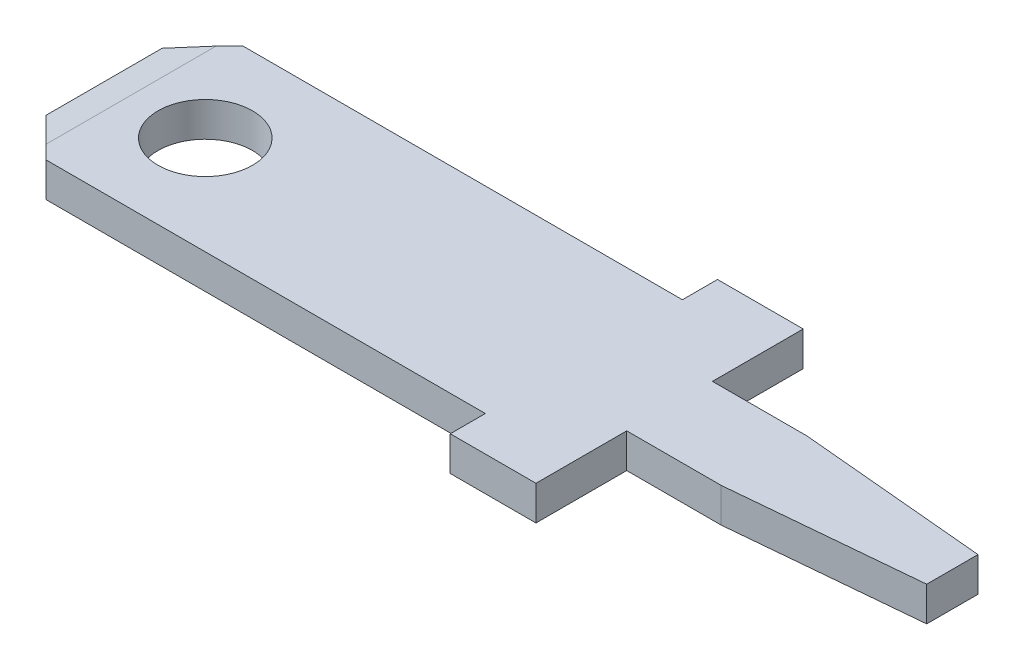
ISO-10303-21;
HEADER;
FILE_DESCRIPTION(('STEP AP214'),'2;1');
FILE_NAME('part.step','',(''),(''),'','','');
FILE_SCHEMA(('AUTOMOTIVE_DESIGN { 1 0 10303 214 1 1 1 1 }'));
ENDSEC;
DATA;
#1=APPLICATION_CONTEXT('core data for automotive mechanical design processes');
#2=APPLICATION_PROTOCOL_DEFINITION('international standard','automotive_design',2000,#1);
#3=PRODUCT_CONTEXT('',#1,'mechanical');
#4=PRODUCT('Part','Part','',(#3));
#5=PRODUCT_RELATED_PRODUCT_CATEGORY('part','',(#4));
#6=PRODUCT_DEFINITION_FORMATION('','',#4);
#7=PRODUCT_DEFINITION_CONTEXT('part definition',#1,'design');
#8=PRODUCT_DEFINITION('design','',#6,#7);
#9=PRODUCT_DEFINITION_SHAPE('','',#8);
#10=(LENGTH_UNIT() NAMED_UNIT(*) SI_UNIT(.MILLI.,.METRE.));
#11=(NAMED_UNIT(*) PLANE_ANGLE_UNIT() SI_UNIT($,.RADIAN.));
#12=(NAMED_UNIT(*) SI_UNIT($,.STERADIAN.) SOLID_ANGLE_UNIT());
#13=UNCERTAINTY_MEASURE_WITH_UNIT(LENGTH_MEASURE(1.E-05),#10,'distance_accuracy_value','');
#14=(GEOMETRIC_REPRESENTATION_CONTEXT(3) GLOBAL_UNCERTAINTY_ASSIGNED_CONTEXT((#13)) GLOBAL_UNIT_ASSIGNED_CONTEXT((#10,
#11,#12)) REPRESENTATION_CONTEXT('',''));
#15=CARTESIAN_POINT('',(0.,0.,0.));
#16=DIRECTION('',(0.,0.,1.));
#17=DIRECTION('',(1.,0.,0.));
#18=AXIS2_PLACEMENT_3D('',#15,#16,#17);
#19=CARTESIAN_POINT('',(0.,0.255,-0.634999999999997));
#20=DIRECTION('',(-1.,0.,0.));
#21=DIRECTION('',(0.,0.,1.));
#22=AXIS2_PLACEMENT_3D('',#19,#20,#21);
#23=PLANE('',#22);
#24=DIRECTION('',(0.,0.,-1.));
#25=VECTOR('',#24,1.);
#26=CARTESIAN_POINT('',(0.,-0.255,-0.634999999999997));
#27=LINE('',#26,#25);
#28=CARTESIAN_POINT('',(0.,-0.255,-0.634999999999997));
#29=VERTEX_POINT('',#28);
#30=CARTESIAN_POINT('',(0.,-0.255,-1.98));
#31=VERTEX_POINT('',#30);
#32=EDGE_CURVE('E172',#29,#31,#27,.T.);
#33=ORIENTED_EDGE('',*,*,#32,.T.);
#34=DIRECTION('',(0.,-1.,0.));
#35=VECTOR('',#34,1.);
#36=CARTESIAN_POINT('',(0.,0.255,-1.98));
#37=LINE('',#36,#35);
#38=CARTESIAN_POINT('',(0.,0.255,-1.98));
#39=VERTEX_POINT('',#38);
#40=EDGE_CURVE('E288',#39,#31,#37,.T.);
#41=ORIENTED_EDGE('',*,*,#40,.F.);
#42=DIRECTION('',(0.,0.,-1.));
#43=VECTOR('',#42,1.);
#44=CARTESIAN_POINT('',(0.,0.255,-0.634999999999997));
#45=LINE('',#44,#43);
#46=CARTESIAN_POINT('',(0.,0.255,-0.634999999999997));
#47=VERTEX_POINT('',#46);
#48=EDGE_CURVE('E234',#47,#39,#45,.T.);
#49=ORIENTED_EDGE('',*,*,#48,.F.);
#50=DIRECTION('',(0.,-1.,0.));
#51=VECTOR('',#50,1.);
#52=CARTESIAN_POINT('',(0.,0.255,-0.634999999999997));
#53=LINE('',#52,#51);
#54=EDGE_CURVE('E252',#47,#29,#53,.T.);
#55=ORIENTED_EDGE('',*,*,#54,.T.);
#56=EDGE_LOOP('',(#33,#41,#49,#55));
#57=FACE_BOUND('',#56,.T.);
#58=ADVANCED_FACE('F32',(#57),#23,.F.);
#59=CARTESIAN_POINT('',(0.,0.255,-1.98));
#60=DIRECTION('',(0.,0.,1.));
#61=DIRECTION('',(1.,0.,0.));
#62=AXIS2_PLACEMENT_3D('',#59,#60,#61);
#63=PLANE('',#62);
#64=DIRECTION('',(-1.,0.,0.));
#65=VECTOR('',#64,1.);
#66=CARTESIAN_POINT('',(0.,-0.255,-1.98));
#67=LINE('',#66,#65);
#68=CARTESIAN_POINT('',(-1.27,-0.255,-1.98));
#69=VERTEX_POINT('',#68);
#70=EDGE_CURVE('E255',#31,#69,#67,.T.);
#71=ORIENTED_EDGE('',*,*,#70,.T.);
#72=DIRECTION('',(0.,-1.,0.));
#73=VECTOR('',#72,1.);
#74=CARTESIAN_POINT('',(-1.27,0.255,-1.98));
#75=LINE('',#74,#73);
#76=CARTESIAN_POINT('',(-1.27,0.255,-1.98));
#77=VERTEX_POINT('',#76);
#78=EDGE_CURVE('E285',#77,#69,#75,.T.);
#79=ORIENTED_EDGE('',*,*,#78,.F.);
#80=DIRECTION('',(-1.,0.,0.));
#81=VECTOR('',#80,1.);
#82=CARTESIAN_POINT('',(0.,0.255,-1.98));
#83=LINE('',#82,#81);
#84=EDGE_CURVE('E237',#39,#77,#83,.T.);
#85=ORIENTED_EDGE('',*,*,#84,.F.);
#86=ORIENTED_EDGE('',*,*,#40,.T.);
#87=EDGE_LOOP('',(#71,#79,#85,#86));
#88=FACE_BOUND('',#87,.T.);
#89=ADVANCED_FACE('F328',(#88),#63,.F.);
#90=CARTESIAN_POINT('',(-1.27,0.255,-1.98));
#91=DIRECTION('',(1.,0.,0.));
#92=DIRECTION('',(0.,0.,-1.));
#93=AXIS2_PLACEMENT_3D('',#90,#91,#92);
#94=PLANE('',#93);
#95=DIRECTION('',(0.,0.,1.));
#96=VECTOR('',#95,1.);
#97=CARTESIAN_POINT('',(-1.27,-0.255,-1.98));
#98=LINE('',#97,#96);
#99=CARTESIAN_POINT('',(-1.27,-0.255,-1.46));
#100=VERTEX_POINT('',#99);
#101=EDGE_CURVE('E257',#69,#100,#98,.T.);
#102=ORIENTED_EDGE('',*,*,#101,.T.);
#103=DIRECTION('',(0.,-1.,0.));
#104=VECTOR('',#103,1.);
#105=CARTESIAN_POINT('',(-1.27,0.255,-1.46));
#106=LINE('',#105,#104);
#107=CARTESIAN_POINT('',(-1.27,0.255,-1.46));
#108=VERTEX_POINT('',#107);
#109=EDGE_CURVE('E282',#108,#100,#106,.T.);
#110=ORIENTED_EDGE('',*,*,#109,.F.);
#111=DIRECTION('',(0.,0.,1.));
#112=VECTOR('',#111,1.);
#113=CARTESIAN_POINT('',(-1.27,0.255,-1.98));
#114=LINE('',#113,#112);
#115=EDGE_CURVE('E240',#77,#108,#114,.T.);
#116=ORIENTED_EDGE('',*,*,#115,.F.);
#117=ORIENTED_EDGE('',*,*,#78,.T.);
#118=EDGE_LOOP('',(#102,#110,#116,#117));
#119=FACE_BOUND('',#118,.T.);
#120=ADVANCED_FACE('F334',(#119),#94,.F.);
#121=CARTESIAN_POINT('',(-1.27,0.255,-1.46));
#122=DIRECTION('',(0.,0.,1.));
#123=DIRECTION('',(1.,0.,0.));
#124=AXIS2_PLACEMENT_3D('',#121,#122,#123);
#125=PLANE('',#124);
#126=DIRECTION('',(-1.,0.,0.));
#127=VECTOR('',#126,1.);
#128=CARTESIAN_POINT('',(-1.27,-0.255,-1.46));
#129=LINE('',#128,#127);
#130=CARTESIAN_POINT('',(-7.78,-0.255,-1.46));
#131=VERTEX_POINT('',#130);
#132=EDGE_CURVE('E259',#100,#131,#129,.T.);
#133=ORIENTED_EDGE('',*,*,#132,.T.);
#134=DIRECTION('',(0.,-1.,0.));
#135=VECTOR('',#134,1.);
#136=CARTESIAN_POINT('',(-7.78,0.255,-1.46));
#137=LINE('',#136,#135);
#138=CARTESIAN_POINT('',(-7.78,0.255,-1.46));
#139=VERTEX_POINT('',#138);
#140=EDGE_CURVE('E279',#139,#131,#137,.T.);
#141=ORIENTED_EDGE('',*,*,#140,.F.);
#142=DIRECTION('',(-1.,0.,0.));
#143=VECTOR('',#142,1.);
#144=CARTESIAN_POINT('',(-1.27,0.255,-1.46));
#145=LINE('',#144,#143);
#146=EDGE_CURVE('E242',#108,#139,#145,.T.);
#147=ORIENTED_EDGE('',*,*,#146,.F.);
#148=ORIENTED_EDGE('',*,*,#109,.T.);
#149=EDGE_LOOP('',(#133,#141,#147,#148));
#150=FACE_BOUND('',#149,.T.);
#151=ADVANCED_FACE('F340',(#150),#125,.F.);
#152=CARTESIAN_POINT('',(-7.78,0.255,-1.46));
#153=DIRECTION('',(0.707106781186546,0.,0.707106781186549));
#154=DIRECTION('',(0.707106781186549,0.,-0.707106781186546));
#155=AXIS2_PLACEMENT_3D('',#152,#153,#154);
#156=PLANE('',#155);
#157=DIRECTION('',(-0.707106781186549,0.,0.707106781186546));
#158=VECTOR('',#157,1.);
#159=CARTESIAN_POINT('',(-7.78,-0.255,-1.46));
#160=LINE('',#159,#158);
#161=CARTESIAN_POINT('',(-7.98000000000006,-0.254999999999997,-1.25999999999994));
#162=VERTEX_POINT('',#161);
#163=EDGE_CURVE('E261',#131,#162,#160,.T.);
#164=ORIENTED_EDGE('',*,*,#163,.T.);
#165=DIRECTION('',(0.70624396752931,-0.0493853891036585,-0.706243967529308));
#166=VECTOR('',#165,1.);
#167=CARTESIAN_POINT('',(-8.38,-0.227029275222596,-0.860000000000001));
#168=LINE('',#167,#166);
#169=CARTESIAN_POINT('',(-8.38,-0.227029275222596,-0.860000000000001));
#170=VERTEX_POINT('',#169);
#171=EDGE_CURVE('E40',#162,#170,#168,.F.);
#172=ORIENTED_EDGE('',*,*,#171,.T.);
#173=DIRECTION('',(0.,-1.,0.));
#174=VECTOR('',#173,1.);
#175=CARTESIAN_POINT('',(-8.38,0.255,-0.860000000000001));
#176=LINE('',#175,#174);
#177=CARTESIAN_POINT('',(-8.38,0.227029275222596,-0.860000000000001));
#178=VERTEX_POINT('',#177);
#179=EDGE_CURVE('E276',#178,#170,#176,.T.);
#180=ORIENTED_EDGE('',*,*,#179,.F.);
#181=DIRECTION('',(0.70624396752931,0.0493853891036585,-0.706243967529308));
#182=VECTOR('',#181,1.);
#183=CARTESIAN_POINT('',(-8.60846348250614,0.21105355224543,-0.631536517493863));
#184=LINE('',#183,#182);
#185=CARTESIAN_POINT('',(-7.98000000000006,0.254999999999997,-1.25999999999994));
#186=VERTEX_POINT('',#185);
#187=EDGE_CURVE('E47',#178,#186,#184,.T.);
#188=ORIENTED_EDGE('',*,*,#187,.T.);
#189=DIRECTION('',(-0.707106781186549,0.,0.707106781186546));
#190=VECTOR('',#189,1.);
#191=CARTESIAN_POINT('',(-7.78,0.255,-1.46));
#192=LINE('',#191,#190);
#193=EDGE_CURVE('E244',#139,#186,#192,.T.);
#194=ORIENTED_EDGE('',*,*,#193,.F.);
#195=ORIENTED_EDGE('',*,*,#140,.T.);
#196=EDGE_LOOP('',(#164,#172,#180,#188,#194,#195));
#197=FACE_BOUND('',#196,.T.);
#198=ADVANCED_FACE('F302',(#197),#156,.F.);
#199=CARTESIAN_POINT('',(-8.38,0.255,-0.860000000000001));
#200=DIRECTION('',(1.,0.,0.));
#201=DIRECTION('',(0.,0.,-1.));
#202=AXIS2_PLACEMENT_3D('',#199,#200,#201);
#203=PLANE('',#202);
#204=ORIENTED_EDGE('',*,*,#179,.T.);
#205=DIRECTION('',(0.,0.,1.));
#206=VECTOR('',#205,1.);
#207=CARTESIAN_POINT('',(-8.38,-0.227029275222596,-0.860000000000001));
#208=LINE('',#207,#206);
#209=CARTESIAN_POINT('',(-8.38,-0.227029275222596,0.860000000000001));
#210=VERTEX_POINT('',#209);
#211=EDGE_CURVE('E293',#170,#210,#208,.T.);
#212=ORIENTED_EDGE('',*,*,#211,.T.);
#213=DIRECTION('',(0.,-1.,0.));
#214=VECTOR('',#213,1.);
#215=CARTESIAN_POINT('',(-8.38,0.255,0.860000000000001));
#216=LINE('',#215,#214);
#217=CARTESIAN_POINT('',(-8.38,0.227029275222596,0.860000000000001));
#218=VERTEX_POINT('',#217);
#219=EDGE_CURVE('E227',#218,#210,#216,.T.);
#220=ORIENTED_EDGE('',*,*,#219,.F.);
#221=DIRECTION('',(0.,0.,-1.));
#222=VECTOR('',#221,1.);
#223=CARTESIAN_POINT('',(-8.38,0.227029275222596,-0.860000000000001));
#224=LINE('',#223,#222);
#225=EDGE_CURVE('E291',#218,#178,#224,.T.);
#226=ORIENTED_EDGE('',*,*,#225,.T.);
#227=EDGE_LOOP('',(#204,#212,#220,#226));
#228=FACE_BOUND('',#227,.T.);
#229=ADVANCED_FACE('F306',(#228),#203,.F.);
#230=CARTESIAN_POINT('',(4.19,0.255,0.));
#231=DIRECTION('',(-1.,0.,0.));
#232=DIRECTION('',(0.,0.,1.));
#233=AXIS2_PLACEMENT_3D('',#230,#231,#232);
#234=PLANE('',#233);
#235=DIRECTION('',(0.,0.,-1.));
#236=VECTOR('',#235,1.);
#237=CARTESIAN_POINT('',(4.19,-0.255,0.));
#238=LINE('',#237,#236);
#239=CARTESIAN_POINT('',(4.19,-0.255,0.38));
#240=VERTEX_POINT('',#239);
#241=CARTESIAN_POINT('',(4.19,-0.255,-0.38));
#242=VERTEX_POINT('',#241);
#243=EDGE_CURVE('E263',#240,#242,#238,.T.);
#244=ORIENTED_EDGE('',*,*,#243,.T.);
#245=DIRECTION('',(0.,-1.,0.));
#246=VECTOR('',#245,1.);
#247=CARTESIAN_POINT('',(4.19,0.255,-0.38));
#248=LINE('',#247,#246);
#249=CARTESIAN_POINT('',(4.19,0.255,-0.38));
#250=VERTEX_POINT('',#249);
#251=EDGE_CURVE('E273',#250,#242,#248,.T.);
#252=ORIENTED_EDGE('',*,*,#251,.F.);
#253=DIRECTION('',(0.,0.,-1.));
#254=VECTOR('',#253,1.);
#255=CARTESIAN_POINT('',(4.19,0.255,0.));
#256=LINE('',#255,#254);
#257=CARTESIAN_POINT('',(4.19,0.255,0.38));
#258=VERTEX_POINT('',#257);
#259=EDGE_CURVE('E246',#258,#250,#256,.T.);
#260=ORIENTED_EDGE('',*,*,#259,.F.);
#261=DIRECTION('',(0.,-1.,0.));
#262=VECTOR('',#261,1.);
#263=CARTESIAN_POINT('',(4.19,0.255,0.38));
#264=LINE('',#263,#262);
#265=EDGE_CURVE('E230',#258,#240,#264,.T.);
#266=ORIENTED_EDGE('',*,*,#265,.T.);
#267=EDGE_LOOP('',(#244,#252,#260,#266));
#268=FACE_BOUND('',#267,.T.);
#269=ADVANCED_FACE('F349',(#268),#234,.F.);
#270=CARTESIAN_POINT('',(4.19,0.255,-0.38));
#271=DIRECTION('',(-0.0910184756337604,0.,0.995849203992907));
#272=DIRECTION('',(0.995849203992907,0.,0.0910184756337604));
#273=AXIS2_PLACEMENT_3D('',#270,#271,#272);
#274=PLANE('',#273);
#275=DIRECTION('',(-0.995849203992907,0.,-0.0910184756337604));
#276=VECTOR('',#275,1.);
#277=CARTESIAN_POINT('',(4.19,-0.255,-0.38));
#278=LINE('',#277,#276);
#279=CARTESIAN_POINT('',(1.4,-0.255,-0.635));
#280=VERTEX_POINT('',#279);
#281=EDGE_CURVE('E265',#242,#280,#278,.T.);
#282=ORIENTED_EDGE('',*,*,#281,.T.);
#283=DIRECTION('',(0.,-1.,0.));
#284=VECTOR('',#283,1.);
#285=CARTESIAN_POINT('',(1.4,0.255,-0.635));
#286=LINE('',#285,#284);
#287=CARTESIAN_POINT('',(1.4,0.255,-0.635));
#288=VERTEX_POINT('',#287);
#289=EDGE_CURVE('E270',#288,#280,#286,.T.);
#290=ORIENTED_EDGE('',*,*,#289,.F.);
#291=DIRECTION('',(-0.995849203992907,0.,-0.0910184756337604));
#292=VECTOR('',#291,1.);
#293=CARTESIAN_POINT('',(4.19,0.255,-0.38));
#294=LINE('',#293,#292);
#295=EDGE_CURVE('E248',#250,#288,#294,.T.);
#296=ORIENTED_EDGE('',*,*,#295,.F.);
#297=ORIENTED_EDGE('',*,*,#251,.T.);
#298=EDGE_LOOP('',(#282,#290,#296,#297));
#299=FACE_BOUND('',#298,.T.);
#300=ADVANCED_FACE('F352',(#299),#274,.F.);
#301=CARTESIAN_POINT('',(1.4,0.255,-0.635));
#302=DIRECTION('',(0.,0.,1.));
#303=DIRECTION('',(1.,0.,0.));
#304=AXIS2_PLACEMENT_3D('',#301,#302,#303);
#305=PLANE('',#304);
#306=DIRECTION('',(-1.,0.,0.));
#307=VECTOR('',#306,1.);
#308=CARTESIAN_POINT('',(1.4,-0.255,-0.635));
#309=LINE('',#308,#307);
#310=EDGE_CURVE('E238',#280,#29,#309,.T.);
#311=ORIENTED_EDGE('',*,*,#310,.T.);
#312=ORIENTED_EDGE('',*,*,#54,.F.);
#313=DIRECTION('',(-1.,0.,0.));
#314=VECTOR('',#313,1.);
#315=CARTESIAN_POINT('',(1.4,0.255,-0.635));
#316=LINE('',#315,#314);
#317=EDGE_CURVE('E250',#288,#47,#316,.T.);
#318=ORIENTED_EDGE('',*,*,#317,.F.);
#319=ORIENTED_EDGE('',*,*,#289,.T.);
#320=EDGE_LOOP('',(#311,#312,#318,#319));
#321=FACE_BOUND('',#320,.T.);
#322=ADVANCED_FACE('F356',(#321),#305,.F.);
#323=CARTESIAN_POINT('',(0.,0.255,0.));
#324=DIRECTION('',(0.,1.,0.));
#325=DIRECTION('',(0.,0.,1.));
#326=AXIS2_PLACEMENT_3D('',#323,#324,#325);
#327=PLANE('',#326);
#328=CARTESIAN_POINT('',(-6.88,0.255,0.));
#329=DIRECTION('',(0.,1.,0.));
#330=DIRECTION('',(0.,0.,1.));
#331=AXIS2_PLACEMENT_3D('',#328,#329,#330);
#332=CIRCLE('',#331,0.7);
#333=CARTESIAN_POINT('',(-6.88,0.255,0.7));
#334=VERTEX_POINT('',#333);
#335=EDGE_CURVE('E396',#334,#334,#332,.T.);
#336=ORIENTED_EDGE('',*,*,#335,.F.);
#337=EDGE_LOOP('',(#336));
#338=FACE_BOUND('',#337,.T.);
#339=ORIENTED_EDGE('',*,*,#193,.T.);
#340=DIRECTION('',(0.,0.,1.));
#341=VECTOR('',#340,1.);
#342=CARTESIAN_POINT('',(-7.97999999999998,0.255,0.86));
#343=LINE('',#342,#341);
#344=CARTESIAN_POINT('',(-7.97999999999998,0.255,1.26000000000002));
#345=VERTEX_POINT('',#344);
#346=EDGE_CURVE('E11',#186,#345,#343,.T.);
#347=ORIENTED_EDGE('',*,*,#346,.T.);
#348=DIRECTION('',(-0.707106781186549,0.,-0.707106781186546));
#349=VECTOR('',#348,1.);
#350=CARTESIAN_POINT('',(-7.78,0.255,1.46));
#351=LINE('',#350,#349);
#352=CARTESIAN_POINT('',(-7.78,0.255,1.46));
#353=VERTEX_POINT('',#352);
#354=EDGE_CURVE('E189',#353,#345,#351,.T.);
#355=ORIENTED_EDGE('',*,*,#354,.F.);
#356=DIRECTION('',(-1.,0.,0.));
#357=VECTOR('',#356,1.);
#358=CARTESIAN_POINT('',(-1.27,0.255,1.46));
#359=LINE('',#358,#357);
#360=CARTESIAN_POINT('',(-1.27,0.255,1.46));
#361=VERTEX_POINT('',#360);
#362=EDGE_CURVE('E195',#361,#353,#359,.T.);
#363=ORIENTED_EDGE('',*,*,#362,.F.);
#364=DIRECTION('',(0.,0.,-1.));
#365=VECTOR('',#364,1.);
#366=CARTESIAN_POINT('',(-1.27,0.255,1.98));
#367=LINE('',#366,#365);
#368=CARTESIAN_POINT('',(-1.27,0.255,1.98));
#369=VERTEX_POINT('',#368);
#370=EDGE_CURVE('E198',#369,#361,#367,.T.);
#371=ORIENTED_EDGE('',*,*,#370,.F.);
#372=DIRECTION('',(-1.,0.,0.));
#373=VECTOR('',#372,1.);
#374=CARTESIAN_POINT('',(0.,0.255,1.98));
#375=LINE('',#374,#373);
#376=CARTESIAN_POINT('',(0.,0.255,1.98));
#377=VERTEX_POINT('',#376);
#378=EDGE_CURVE('E183',#377,#369,#375,.T.);
#379=ORIENTED_EDGE('',*,*,#378,.F.);
#380=DIRECTION('',(0.,0.,1.));
#381=VECTOR('',#380,1.);
#382=CARTESIAN_POINT('',(0.,0.255,0.634999999999997));
#383=LINE('',#382,#381);
#384=CARTESIAN_POINT('',(0.,0.255,0.634999999999997));
#385=VERTEX_POINT('',#384);
#386=EDGE_CURVE('E164',#385,#377,#383,.T.);
#387=ORIENTED_EDGE('',*,*,#386,.F.);
#388=DIRECTION('',(-1.,0.,0.));
#389=VECTOR('',#388,1.);
#390=CARTESIAN_POINT('',(1.4,0.255,0.635));
#391=LINE('',#390,#389);
#392=CARTESIAN_POINT('',(1.4,0.255,0.635));
#393=VERTEX_POINT('',#392);
#394=EDGE_CURVE('E179',#393,#385,#391,.T.);
#395=ORIENTED_EDGE('',*,*,#394,.F.);
#396=DIRECTION('',(-0.995849203992907,0.,0.0910184756337604));
#397=VECTOR('',#396,1.);
#398=CARTESIAN_POINT('',(4.19,0.255,0.38));
#399=LINE('',#398,#397);
#400=EDGE_CURVE('E187',#258,#393,#399,.T.);
#401=ORIENTED_EDGE('',*,*,#400,.F.);
#402=ORIENTED_EDGE('',*,*,#259,.T.);
#403=ORIENTED_EDGE('',*,*,#295,.T.);
#404=ORIENTED_EDGE('',*,*,#317,.T.);
#405=ORIENTED_EDGE('',*,*,#48,.T.);
#406=ORIENTED_EDGE('',*,*,#84,.T.);
#407=ORIENTED_EDGE('',*,*,#115,.T.);
#408=ORIENTED_EDGE('',*,*,#146,.T.);
#409=EDGE_LOOP('',(#339,#347,#355,#363,#371,#379,#387,#395,#401,#402,#403,#404,#405,#406,#407,#408));
#410=FACE_BOUND('',#409,.T.);
#411=ADVANCED_FACE('F177',(#338,#410),#327,.T.);
#412=CARTESIAN_POINT('',(0.,-0.255,0.));
#413=DIRECTION('',(0.,1.,0.));
#414=DIRECTION('',(0.,0.,1.));
#415=AXIS2_PLACEMENT_3D('',#412,#413,#414);
#416=PLANE('',#415);
#417=CARTESIAN_POINT('',(-6.88,-0.255,0.));
#418=DIRECTION('',(0.,1.,0.));
#419=DIRECTION('',(0.,0.,1.));
#420=AXIS2_PLACEMENT_3D('',#417,#418,#419);
#421=CIRCLE('',#420,0.7);
#422=CARTESIAN_POINT('',(-6.88,-0.255,0.7));
#423=VERTEX_POINT('',#422);
#424=EDGE_CURVE('E205',#423,#423,#421,.T.);
#425=ORIENTED_EDGE('',*,*,#424,.T.);
#426=EDGE_LOOP('',(#425));
#427=FACE_BOUND('',#426,.T.);
#428=DIRECTION('',(-0.707106781186549,0.,-0.707106781186546));
#429=VECTOR('',#428,1.);
#430=CARTESIAN_POINT('',(-7.78,-0.255,1.46));
#431=LINE('',#430,#429);
#432=CARTESIAN_POINT('',(-7.78,-0.255,1.46));
#433=VERTEX_POINT('',#432);
#434=CARTESIAN_POINT('',(-7.97999999999998,-0.255,1.26000000000002));
#435=VERTEX_POINT('',#434);
#436=EDGE_CURVE('E210',#433,#435,#431,.T.);
#437=ORIENTED_EDGE('',*,*,#436,.T.);
#438=DIRECTION('',(0.,0.,-1.));
#439=VECTOR('',#438,1.);
#440=CARTESIAN_POINT('',(-7.97999999999998,-0.255,0.));
#441=LINE('',#440,#439);
#442=EDGE_CURVE('E55',#435,#162,#441,.T.);
#443=ORIENTED_EDGE('',*,*,#442,.T.);
#444=ORIENTED_EDGE('',*,*,#163,.F.);
#445=ORIENTED_EDGE('',*,*,#132,.F.);
#446=ORIENTED_EDGE('',*,*,#101,.F.);
#447=ORIENTED_EDGE('',*,*,#70,.F.);
#448=ORIENTED_EDGE('',*,*,#32,.F.);
#449=ORIENTED_EDGE('',*,*,#310,.F.);
#450=ORIENTED_EDGE('',*,*,#281,.F.);
#451=ORIENTED_EDGE('',*,*,#243,.F.);
#452=DIRECTION('',(-0.995849203992907,0.,0.0910184756337604));
#453=VECTOR('',#452,1.);
#454=CARTESIAN_POINT('',(4.19,-0.255,0.38));
#455=LINE('',#454,#453);
#456=CARTESIAN_POINT('',(1.4,-0.255,0.635));
#457=VERTEX_POINT('',#456);
#458=EDGE_CURVE('E207',#240,#457,#455,.T.);
#459=ORIENTED_EDGE('',*,*,#458,.T.);
#460=DIRECTION('',(-1.,0.,0.));
#461=VECTOR('',#460,1.);
#462=CARTESIAN_POINT('',(1.4,-0.255,0.635));
#463=LINE('',#462,#461);
#464=CARTESIAN_POINT('',(0.,-0.255,0.634999999999997));
#465=VERTEX_POINT('',#464);
#466=EDGE_CURVE('E204',#457,#465,#463,.T.);
#467=ORIENTED_EDGE('',*,*,#466,.T.);
#468=DIRECTION('',(0.,0.,1.));
#469=VECTOR('',#468,1.);
#470=CARTESIAN_POINT('',(0.,-0.255,0.634999999999997));
#471=LINE('',#470,#469);
#472=CARTESIAN_POINT('',(0.,-0.255,1.98));
#473=VERTEX_POINT('',#472);
#474=EDGE_CURVE('E167',#465,#473,#471,.T.);
#475=ORIENTED_EDGE('',*,*,#474,.T.);
#476=DIRECTION('',(-1.,0.,0.));
#477=VECTOR('',#476,1.);
#478=CARTESIAN_POINT('',(0.,-0.255,1.98));
#479=LINE('',#478,#477);
#480=CARTESIAN_POINT('',(-1.27,-0.255,1.98));
#481=VERTEX_POINT('',#480);
#482=EDGE_CURVE('E184',#473,#481,#479,.T.);
#483=ORIENTED_EDGE('',*,*,#482,.T.);
#484=DIRECTION('',(0.,0.,-1.));
#485=VECTOR('',#484,1.);
#486=CARTESIAN_POINT('',(-1.27,-0.255,1.98));
#487=LINE('',#486,#485);
#488=CARTESIAN_POINT('',(-1.27,-0.255,1.46));
#489=VERTEX_POINT('',#488);
#490=EDGE_CURVE('E215',#481,#489,#487,.T.);
#491=ORIENTED_EDGE('',*,*,#490,.T.);
#492=DIRECTION('',(-1.,0.,0.));
#493=VECTOR('',#492,1.);
#494=CARTESIAN_POINT('',(-1.27,-0.255,1.46));
#495=LINE('',#494,#493);
#496=EDGE_CURVE('E212',#489,#433,#495,.T.);
#497=ORIENTED_EDGE('',*,*,#496,.T.);
#498=EDGE_LOOP('',(#437,#443,#444,#445,#446,#447,#448,#449,#450,#451,#459,#467,#475,#483,#491,#497));
#499=FACE_BOUND('',#498,.T.);
#500=ADVANCED_FACE('F313',(#427,#499),#416,.F.);
#501=CARTESIAN_POINT('',(0.,0.255,0.634999999999997));
#502=DIRECTION('',(1.,0.,0.));
#503=DIRECTION('',(0.,0.,-1.));
#504=AXIS2_PLACEMENT_3D('',#501,#502,#503);
#505=PLANE('',#504);
#506=ORIENTED_EDGE('',*,*,#474,.F.);
#507=DIRECTION('',(0.,-1.,0.));
#508=VECTOR('',#507,1.);
#509=CARTESIAN_POINT('',(0.,0.255,0.634999999999997));
#510=LINE('',#509,#508);
#511=EDGE_CURVE('E161',#385,#465,#510,.T.);
#512=ORIENTED_EDGE('',*,*,#511,.F.);
#513=ORIENTED_EDGE('',*,*,#386,.T.);
#514=DIRECTION('',(0.,-1.,0.));
#515=VECTOR('',#514,1.);
#516=CARTESIAN_POINT('',(0.,0.255,1.98));
#517=LINE('',#516,#515);
#518=EDGE_CURVE('E202',#377,#473,#517,.T.);
#519=ORIENTED_EDGE('',*,*,#518,.T.);
#520=EDGE_LOOP('',(#506,#512,#513,#519));
#521=FACE_BOUND('',#520,.T.);
#522=ADVANCED_FACE('F163',(#521),#505,.T.);
#523=CARTESIAN_POINT('',(1.4,0.255,0.635));
#524=DIRECTION('',(0.,0.,1.));
#525=DIRECTION('',(1.,0.,0.));
#526=AXIS2_PLACEMENT_3D('',#523,#524,#525);
#527=PLANE('',#526);
#528=ORIENTED_EDGE('',*,*,#466,.F.);
#529=DIRECTION('',(0.,-1.,0.));
#530=VECTOR('',#529,1.);
#531=CARTESIAN_POINT('',(1.4,0.255,0.635));
#532=LINE('',#531,#530);
#533=EDGE_CURVE('E173',#393,#457,#532,.T.);
#534=ORIENTED_EDGE('',*,*,#533,.F.);
#535=ORIENTED_EDGE('',*,*,#394,.T.);
#536=ORIENTED_EDGE('',*,*,#511,.T.);
#537=EDGE_LOOP('',(#528,#534,#535,#536));
#538=FACE_BOUND('',#537,.T.);
#539=ADVANCED_FACE('F186',(#538),#527,.T.);
#540=CARTESIAN_POINT('',(4.19,0.255,0.38));
#541=DIRECTION('',(0.0910184756337604,0.,0.995849203992907));
#542=DIRECTION('',(0.995849203992907,0.,-0.0910184756337604));
#543=AXIS2_PLACEMENT_3D('',#540,#541,#542);
#544=PLANE('',#543);
#545=ORIENTED_EDGE('',*,*,#458,.F.);
#546=ORIENTED_EDGE('',*,*,#265,.F.);
#547=ORIENTED_EDGE('',*,*,#400,.T.);
#548=ORIENTED_EDGE('',*,*,#533,.T.);
#549=EDGE_LOOP('',(#545,#546,#547,#548));
#550=FACE_BOUND('',#549,.T.);
#551=ADVANCED_FACE('F371',(#550),#544,.T.);
#552=CARTESIAN_POINT('',(-7.78,0.255,1.46));
#553=DIRECTION('',(-0.707106781186546,0.,0.707106781186549));
#554=DIRECTION('',(0.707106781186549,0.,0.707106781186546));
#555=AXIS2_PLACEMENT_3D('',#552,#553,#554);
#556=PLANE('',#555);
#557=ORIENTED_EDGE('',*,*,#219,.T.);
#558=DIRECTION('',(-0.70624396752931,0.0493853891036583,-0.706243967529308));
#559=VECTOR('',#558,1.);
#560=CARTESIAN_POINT('',(-7.79827563123204,-0.267707405760388,1.44172436876796));
#561=LINE('',#560,#559);
#562=EDGE_CURVE('E298',#210,#435,#561,.F.);
#563=ORIENTED_EDGE('',*,*,#562,.T.);
#564=ORIENTED_EDGE('',*,*,#436,.F.);
#565=DIRECTION('',(0.,-1.,0.));
#566=VECTOR('',#565,1.);
#567=CARTESIAN_POINT('',(-7.78,0.255,1.46));
#568=LINE('',#567,#566);
#569=EDGE_CURVE('E225',#353,#433,#568,.T.);
#570=ORIENTED_EDGE('',*,*,#569,.F.);
#571=ORIENTED_EDGE('',*,*,#354,.T.);
#572=DIRECTION('',(-0.70624396752931,-0.0493853891036583,-0.706243967529308));
#573=VECTOR('',#572,1.);
#574=CARTESIAN_POINT('',(-7.78048778333138,0.268951253255417,1.45951221666862));
#575=LINE('',#574,#573);
#576=EDGE_CURVE('E296',#345,#218,#575,.T.);
#577=ORIENTED_EDGE('',*,*,#576,.T.);
#578=EDGE_LOOP('',(#557,#563,#564,#570,#571,#577));
#579=FACE_BOUND('',#578,.T.);
#580=ADVANCED_FACE('F312',(#579),#556,.T.);
#581=CARTESIAN_POINT('',(-1.27,0.255,1.46));
#582=DIRECTION('',(0.,0.,1.));
#583=DIRECTION('',(1.,0.,0.));
#584=AXIS2_PLACEMENT_3D('',#581,#582,#583);
#585=PLANE('',#584);
#586=ORIENTED_EDGE('',*,*,#496,.F.);
#587=DIRECTION('',(0.,-1.,0.));
#588=VECTOR('',#587,1.);
#589=CARTESIAN_POINT('',(-1.27,0.255,1.46));
#590=LINE('',#589,#588);
#591=EDGE_CURVE('E223',#361,#489,#590,.T.);
#592=ORIENTED_EDGE('',*,*,#591,.F.);
#593=ORIENTED_EDGE('',*,*,#362,.T.);
#594=ORIENTED_EDGE('',*,*,#569,.T.);
#595=EDGE_LOOP('',(#586,#592,#593,#594));
#596=FACE_BOUND('',#595,.T.);
#597=ADVANCED_FACE('F317',(#596),#585,.T.);
#598=CARTESIAN_POINT('',(-1.27,0.255,1.98));
#599=DIRECTION('',(-1.,0.,0.));
#600=DIRECTION('',(0.,0.,1.));
#601=AXIS2_PLACEMENT_3D('',#598,#599,#600);
#602=PLANE('',#601);
#603=ORIENTED_EDGE('',*,*,#490,.F.);
#604=DIRECTION('',(0.,-1.,0.));
#605=VECTOR('',#604,1.);
#606=CARTESIAN_POINT('',(-1.27,0.255,1.98));
#607=LINE('',#606,#605);
#608=EDGE_CURVE('E221',#369,#481,#607,.T.);
#609=ORIENTED_EDGE('',*,*,#608,.F.);
#610=ORIENTED_EDGE('',*,*,#370,.T.);
#611=ORIENTED_EDGE('',*,*,#591,.T.);
#612=EDGE_LOOP('',(#603,#609,#610,#611));
#613=FACE_BOUND('',#612,.T.);
#614=ADVANCED_FACE('F379',(#613),#602,.T.);
#615=CARTESIAN_POINT('',(0.,0.255,1.98));
#616=DIRECTION('',(0.,0.,1.));
#617=DIRECTION('',(1.,0.,0.));
#618=AXIS2_PLACEMENT_3D('',#615,#616,#617);
#619=PLANE('',#618);
#620=ORIENTED_EDGE('',*,*,#482,.F.);
#621=ORIENTED_EDGE('',*,*,#518,.F.);
#622=ORIENTED_EDGE('',*,*,#378,.T.);
#623=ORIENTED_EDGE('',*,*,#608,.T.);
#624=EDGE_LOOP('',(#620,#621,#622,#623));
#625=FACE_BOUND('',#624,.T.);
#626=ADVANCED_FACE('F382',(#625),#619,.T.);
#627=CARTESIAN_POINT('',(-6.88,-0.255,0.));
#628=DIRECTION('',(0.,1.,0.));
#629=DIRECTION('',(0.,0.,1.));
#630=AXIS2_PLACEMENT_3D('',#627,#628,#629);
#631=CYLINDRICAL_SURFACE('',#630,0.7);
#632=ORIENTED_EDGE('',*,*,#424,.F.);
#633=EDGE_LOOP('',(#632));
#634=FACE_BOUND('',#633,.T.);
#635=ORIENTED_EDGE('',*,*,#335,.T.);
#636=EDGE_LOOP('',(#635));
#637=FACE_BOUND('',#636,.T.);
#638=ADVANCED_FACE('F326',(#634,#637),#631,.F.);
#639=CARTESIAN_POINT('',(-8.38,-0.227029275222596,-0.860000000000001));
#640=DIRECTION('',(0.0697564737441219,0.997564050259824,0.));
#641=DIRECTION('',(0.,0.,1.));
#642=AXIS2_PLACEMENT_3D('',#639,#640,#641);
#643=PLANE('',#642);
#644=ORIENTED_EDGE('',*,*,#171,.F.);
#645=ORIENTED_EDGE('',*,*,#442,.F.);
#646=ORIENTED_EDGE('',*,*,#562,.F.);
#647=ORIENTED_EDGE('',*,*,#211,.F.);
#648=EDGE_LOOP('',(#644,#645,#646,#647));
#649=FACE_BOUND('',#648,.T.);
#650=ADVANCED_FACE('F309',(#649),#643,.F.);
#651=CARTESIAN_POINT('',(-7.97999999999998,0.255,0.));
#652=DIRECTION('',(-0.0697564737441219,0.997564050259824,0.));
#653=DIRECTION('',(0.,0.,-1.));
#654=AXIS2_PLACEMENT_3D('',#651,#652,#653);
#655=PLANE('',#654);
#656=ORIENTED_EDGE('',*,*,#187,.F.);
#657=ORIENTED_EDGE('',*,*,#225,.F.);
#658=ORIENTED_EDGE('',*,*,#576,.F.);
#659=ORIENTED_EDGE('',*,*,#346,.F.);
#660=EDGE_LOOP('',(#656,#657,#658,#659));
#661=FACE_BOUND('',#660,.T.);
#662=ADVANCED_FACE('F34',(#661),#655,.T.);
#663=CLOSED_SHELL('',(#58,#89,#120,#151,#198,#229,#269,#300,#322,#411,#500,#522,#539,#551,#580,
#597,#614,#626,#638,#650,#662));
#664=MANIFOLD_SOLID_BREP('B2',#663);
#665=ADVANCED_BREP_SHAPE_REPRESENTATION('',(#18,#664),#14);
#666=SHAPE_DEFINITION_REPRESENTATION(#9,#665);
ENDSEC;
END-ISO-10303-21;
